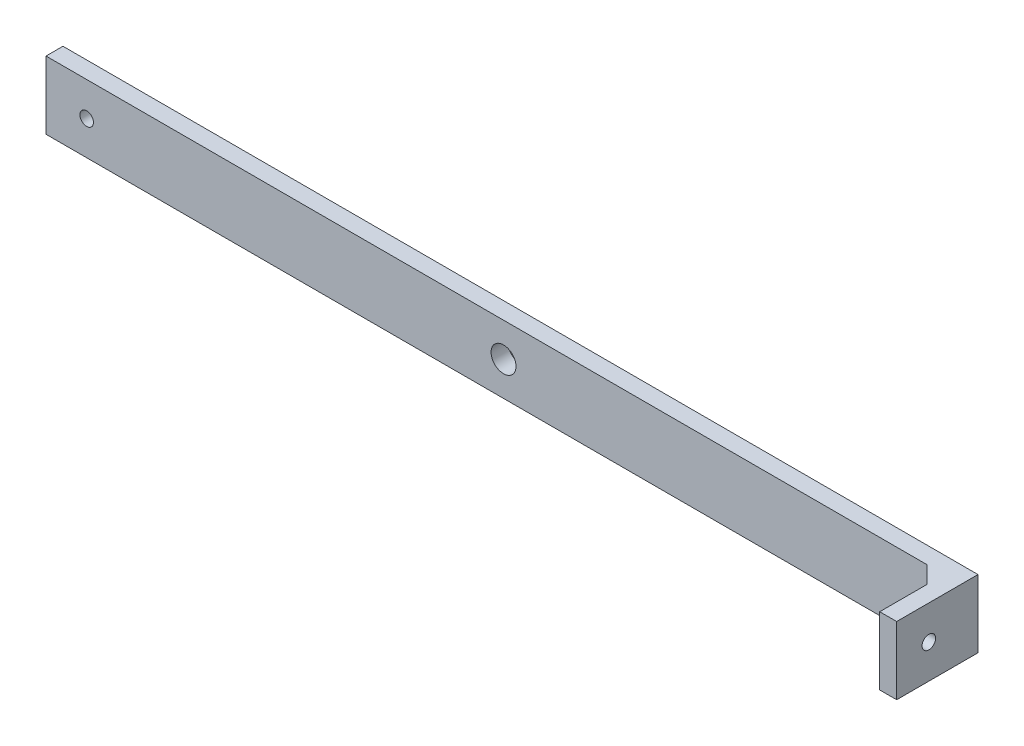
ISO-10303-21;
HEADER;
FILE_DESCRIPTION(('STEP AP214'),'2;1');
FILE_NAME('part.step','',(''),(''),'','','');
FILE_SCHEMA(('AUTOMOTIVE_DESIGN { 1 0 10303 214 1 1 1 1 }'));
ENDSEC;
DATA;
#1=APPLICATION_CONTEXT('core data for automotive mechanical design processes');
#2=APPLICATION_PROTOCOL_DEFINITION('international standard','automotive_design',2000,#1);
#3=PRODUCT_CONTEXT('',#1,'mechanical');
#4=PRODUCT('Part','Part','',(#3));
#5=PRODUCT_RELATED_PRODUCT_CATEGORY('part','',(#4));
#6=PRODUCT_DEFINITION_FORMATION('','',#4);
#7=PRODUCT_DEFINITION_CONTEXT('part definition',#1,'design');
#8=PRODUCT_DEFINITION('design','',#6,#7);
#9=PRODUCT_DEFINITION_SHAPE('','',#8);
#10=(LENGTH_UNIT() NAMED_UNIT(*) SI_UNIT(.MILLI.,.METRE.));
#11=(NAMED_UNIT(*) PLANE_ANGLE_UNIT() SI_UNIT($,.RADIAN.));
#12=(NAMED_UNIT(*) SI_UNIT($,.STERADIAN.) SOLID_ANGLE_UNIT());
#13=UNCERTAINTY_MEASURE_WITH_UNIT(LENGTH_MEASURE(1.E-05),#10,'distance_accuracy_value','');
#14=(GEOMETRIC_REPRESENTATION_CONTEXT(3) GLOBAL_UNCERTAINTY_ASSIGNED_CONTEXT((#13)) GLOBAL_UNIT_ASSIGNED_CONTEXT((#10,
#11,#12)) REPRESENTATION_CONTEXT('',''));
#15=CARTESIAN_POINT('',(0.,0.,0.));
#16=DIRECTION('',(0.,0.,1.));
#17=DIRECTION('',(1.,0.,0.));
#18=AXIS2_PLACEMENT_3D('',#15,#16,#17);
#19=CARTESIAN_POINT('',(0.,0.,5.));
#20=DIRECTION('',(0.,0.,-1.));
#21=DIRECTION('',(-1.,0.,0.));
#22=AXIS2_PLACEMENT_3D('',#19,#20,#21);
#23=PLANE('',#22);
#24=CARTESIAN_POINT('',(0.,0.,5.));
#25=DIRECTION('',(0.,0.,-1.));
#26=DIRECTION('',(-1.,0.,0.));
#27=AXIS2_PLACEMENT_3D('',#24,#25,#26);
#28=CIRCLE('',#27,3.68294157014292);
#29=CARTESIAN_POINT('',(-3.68294157014292,0.,5.));
#30=VERTEX_POINT('',#29);
#31=EDGE_CURVE('E376',#30,#30,#28,.T.);
#32=ORIENTED_EDGE('',*,*,#31,.T.);
#33=EDGE_LOOP('',(#32));
#34=FACE_BOUND('',#33,.T.);
#35=CARTESIAN_POINT('',(-123.,0.,5.));
#36=DIRECTION('',(0.,0.,-1.));
#37=DIRECTION('',(-1.,0.,0.));
#38=AXIS2_PLACEMENT_3D('',#35,#36,#37);
#39=CIRCLE('',#38,2.);
#40=CARTESIAN_POINT('',(-125.,0.,5.));
#41=VERTEX_POINT('',#40);
#42=EDGE_CURVE('E380',#41,#41,#39,.T.);
#43=ORIENTED_EDGE('',*,*,#42,.T.);
#44=EDGE_LOOP('',(#43));
#45=FACE_BOUND('',#44,.T.);
#46=DIRECTION('',(1.,0.,0.));
#47=VECTOR('',#46,1.);
#48=CARTESIAN_POINT('',(125.,5.,5.));
#49=LINE('',#48,#47);
#50=CARTESIAN_POINT('',(125.,5.,5.));
#51=VERTEX_POINT('',#50);
#52=CARTESIAN_POINT('',(130.,5.,5.));
#53=VERTEX_POINT('',#52);
#54=EDGE_CURVE('E200',#51,#53,#49,.T.);
#55=ORIENTED_EDGE('',*,*,#54,.F.);
#56=DIRECTION('',(0.,-1.,0.));
#57=VECTOR('',#56,1.);
#58=CARTESIAN_POINT('',(125.,10.,5.));
#59=LINE('',#58,#57);
#60=CARTESIAN_POINT('',(125.,10.,5.));
#61=VERTEX_POINT('',#60);
#62=EDGE_CURVE('E117',#61,#51,#59,.T.);
#63=ORIENTED_EDGE('',*,*,#62,.F.);
#64=DIRECTION('',(-1.,0.,0.));
#65=VECTOR('',#64,1.);
#66=CARTESIAN_POINT('',(-135.,10.,5.));
#67=LINE('',#66,#65);
#68=CARTESIAN_POINT('',(-135.,10.,5.));
#69=VERTEX_POINT('',#68);
#70=EDGE_CURVE('E127',#61,#69,#67,.T.);
#71=ORIENTED_EDGE('',*,*,#70,.T.);
#72=DIRECTION('',(0.,-1.,0.));
#73=VECTOR('',#72,1.);
#74=CARTESIAN_POINT('',(-135.,-10.,5.));
#75=LINE('',#74,#73);
#76=CARTESIAN_POINT('',(-135.,-10.,5.));
#77=VERTEX_POINT('',#76);
#78=EDGE_CURVE('E147',#69,#77,#75,.T.);
#79=ORIENTED_EDGE('',*,*,#78,.T.);
#80=DIRECTION('',(1.,0.,0.));
#81=VECTOR('',#80,1.);
#82=CARTESIAN_POINT('',(-135.,-10.,5.));
#83=LINE('',#82,#81);
#84=CARTESIAN_POINT('',(125.,-10.,5.));
#85=VERTEX_POINT('',#84);
#86=EDGE_CURVE('E150',#77,#85,#83,.T.);
#87=ORIENTED_EDGE('',*,*,#86,.T.);
#88=DIRECTION('',(0.,-1.,0.));
#89=VECTOR('',#88,1.);
#90=CARTESIAN_POINT('',(125.,-10.,5.));
#91=LINE('',#90,#89);
#92=CARTESIAN_POINT('',(125.,-5.,5.));
#93=VERTEX_POINT('',#92);
#94=EDGE_CURVE('E202',#93,#85,#91,.T.);
#95=ORIENTED_EDGE('',*,*,#94,.F.);
#96=DIRECTION('',(1.,0.,0.));
#97=VECTOR('',#96,1.);
#98=CARTESIAN_POINT('',(125.,-5.,5.));
#99=LINE('',#98,#97);
#100=CARTESIAN_POINT('',(130.,-5.,5.));
#101=VERTEX_POINT('',#100);
#102=EDGE_CURVE('E207',#93,#101,#99,.T.);
#103=ORIENTED_EDGE('',*,*,#102,.T.);
#104=DIRECTION('',(0.,-1.,0.));
#105=VECTOR('',#104,1.);
#106=CARTESIAN_POINT('',(130.,10.,5.));
#107=LINE('',#106,#105);
#108=EDGE_CURVE('E184',#53,#101,#107,.T.);
#109=ORIENTED_EDGE('',*,*,#108,.F.);
#110=EDGE_LOOP('',(#55,#63,#71,#79,#87,#95,#103,#109));
#111=FACE_BOUND('',#110,.T.);
#112=ADVANCED_FACE('F36',(#34,#45,#111),#23,.F.);
#113=CARTESIAN_POINT('',(130.,10.,24.));
#114=DIRECTION('',(1.,0.,0.));
#115=DIRECTION('',(0.,0.,-1.));
#116=AXIS2_PLACEMENT_3D('',#113,#114,#115);
#117=PLANE('',#116);
#118=DIRECTION('',(0.,0.,-1.));
#119=VECTOR('',#118,1.);
#120=CARTESIAN_POINT('',(130.,-5.,5.));
#121=LINE('',#120,#119);
#122=CARTESIAN_POINT('',(130.,-5.,10.));
#123=VERTEX_POINT('',#122);
#124=EDGE_CURVE('E197',#123,#101,#121,.T.);
#125=ORIENTED_EDGE('',*,*,#124,.F.);
#126=DIRECTION('',(0.,1.,0.));
#127=VECTOR('',#126,1.);
#128=CARTESIAN_POINT('',(130.,-10.,10.));
#129=LINE('',#128,#127);
#130=CARTESIAN_POINT('',(130.,-10.,10.));
#131=VERTEX_POINT('',#130);
#132=EDGE_CURVE('E195',#131,#123,#129,.T.);
#133=ORIENTED_EDGE('',*,*,#132,.F.);
#134=DIRECTION('',(0.,0.,-1.));
#135=VECTOR('',#134,1.);
#136=CARTESIAN_POINT('',(130.,-10.,24.));
#137=LINE('',#136,#135);
#138=CARTESIAN_POINT('',(130.,-10.,24.));
#139=VERTEX_POINT('',#138);
#140=EDGE_CURVE('E136',#139,#131,#137,.T.);
#141=ORIENTED_EDGE('',*,*,#140,.F.);
#142=DIRECTION('',(0.,-1.,0.));
#143=VECTOR('',#142,1.);
#144=CARTESIAN_POINT('',(130.,10.,24.));
#145=LINE('',#144,#143);
#146=CARTESIAN_POINT('',(130.,10.,24.));
#147=VERTEX_POINT('',#146);
#148=EDGE_CURVE('E134',#147,#139,#145,.T.);
#149=ORIENTED_EDGE('',*,*,#148,.F.);
#150=DIRECTION('',(0.,0.,-1.));
#151=VECTOR('',#150,1.);
#152=CARTESIAN_POINT('',(130.,10.,24.));
#153=LINE('',#152,#151);
#154=CARTESIAN_POINT('',(130.,10.,10.));
#155=VERTEX_POINT('',#154);
#156=EDGE_CURVE('E124',#147,#155,#153,.T.);
#157=ORIENTED_EDGE('',*,*,#156,.T.);
#158=DIRECTION('',(0.,1.,0.));
#159=VECTOR('',#158,1.);
#160=CARTESIAN_POINT('',(130.,10.,10.));
#161=LINE('',#160,#159);
#162=CARTESIAN_POINT('',(130.,5.,10.));
#163=VERTEX_POINT('',#162);
#164=EDGE_CURVE('E112',#163,#155,#161,.T.);
#165=ORIENTED_EDGE('',*,*,#164,.F.);
#166=DIRECTION('',(0.,0.,1.));
#167=VECTOR('',#166,1.);
#168=CARTESIAN_POINT('',(130.,5.,5.));
#169=LINE('',#168,#167);
#170=EDGE_CURVE('E52',#53,#163,#169,.T.);
#171=ORIENTED_EDGE('',*,*,#170,.F.);
#172=ORIENTED_EDGE('',*,*,#108,.T.);
#173=EDGE_LOOP('',(#125,#133,#141,#149,#157,#165,#171,#172));
#174=FACE_BOUND('',#173,.T.);
#175=CARTESIAN_POINT('',(130.,0.,14.5));
#176=DIRECTION('',(1.,0.,0.));
#177=DIRECTION('',(0.,0.,-1.));
#178=AXIS2_PLACEMENT_3D('',#175,#176,#177);
#179=CIRCLE('',#178,2.);
#180=CARTESIAN_POINT('',(130.,0.,12.5));
#181=VERTEX_POINT('',#180);
#182=EDGE_CURVE('E40',#181,#181,#179,.T.);
#183=ORIENTED_EDGE('',*,*,#182,.T.);
#184=EDGE_LOOP('',(#183));
#185=FACE_BOUND('',#184,.T.);
#186=ADVANCED_FACE('F131',(#174,#185),#117,.F.);
#187=CARTESIAN_POINT('',(135.,-10.,5.));
#188=DIRECTION('',(-1.,0.,0.));
#189=DIRECTION('',(0.,0.,1.));
#190=AXIS2_PLACEMENT_3D('',#187,#188,#189);
#191=PLANE('',#190);
#192=CARTESIAN_POINT('',(135.,0.,14.5));
#193=DIRECTION('',(1.,0.,0.));
#194=DIRECTION('',(0.,0.,-1.));
#195=AXIS2_PLACEMENT_3D('',#192,#193,#194);
#196=CIRCLE('',#195,2.);
#197=CARTESIAN_POINT('',(135.,0.,12.5));
#198=VERTEX_POINT('',#197);
#199=EDGE_CURVE('E188',#198,#198,#196,.T.);
#200=ORIENTED_EDGE('',*,*,#199,.F.);
#201=EDGE_LOOP('',(#200));
#202=FACE_BOUND('',#201,.T.);
#203=DIRECTION('',(0.,1.,0.));
#204=VECTOR('',#203,1.);
#205=CARTESIAN_POINT('',(135.,-10.,0.));
#206=LINE('',#205,#204);
#207=CARTESIAN_POINT('',(135.,-10.,0.));
#208=VERTEX_POINT('',#207);
#209=CARTESIAN_POINT('',(135.,10.,0.));
#210=VERTEX_POINT('',#209);
#211=EDGE_CURVE('E135',#208,#210,#206,.T.);
#212=ORIENTED_EDGE('',*,*,#211,.T.);
#213=DIRECTION('',(0.,0.,-1.));
#214=VECTOR('',#213,1.);
#215=CARTESIAN_POINT('',(135.,10.,5.));
#216=LINE('',#215,#214);
#217=CARTESIAN_POINT('',(135.,10.,24.));
#218=VERTEX_POINT('',#217);
#219=EDGE_CURVE('E11',#218,#210,#216,.T.);
#220=ORIENTED_EDGE('',*,*,#219,.F.);
#221=DIRECTION('',(0.,1.,0.));
#222=VECTOR('',#221,1.);
#223=CARTESIAN_POINT('',(135.,10.,24.));
#224=LINE('',#223,#222);
#225=CARTESIAN_POINT('',(135.,-10.,24.));
#226=VERTEX_POINT('',#225);
#227=EDGE_CURVE('E181',#226,#218,#224,.T.);
#228=ORIENTED_EDGE('',*,*,#227,.F.);
#229=DIRECTION('',(0.,0.,-1.));
#230=VECTOR('',#229,1.);
#231=CARTESIAN_POINT('',(135.,-10.,5.));
#232=LINE('',#231,#230);
#233=EDGE_CURVE('E152',#226,#208,#232,.T.);
#234=ORIENTED_EDGE('',*,*,#233,.T.);
#235=EDGE_LOOP('',(#212,#220,#228,#234));
#236=FACE_BOUND('',#235,.T.);
#237=ADVANCED_FACE('F38',(#202,#236),#191,.F.);
#238=CARTESIAN_POINT('',(-135.,10.,5.));
#239=DIRECTION('',(0.,-1.,0.));
#240=DIRECTION('',(0.,0.,-1.));
#241=AXIS2_PLACEMENT_3D('',#238,#239,#240);
#242=PLANE('',#241);
#243=ORIENTED_EDGE('',*,*,#70,.F.);
#244=DIRECTION('',(0.707106781186548,0.,0.707106781186547));
#245=VECTOR('',#244,1.);
#246=CARTESIAN_POINT('',(125.,10.,5.));
#247=LINE('',#246,#245);
#248=EDGE_CURVE('E60',#61,#155,#247,.T.);
#249=ORIENTED_EDGE('',*,*,#248,.T.);
#250=ORIENTED_EDGE('',*,*,#156,.F.);
#251=DIRECTION('',(-1.,0.,0.));
#252=VECTOR('',#251,1.);
#253=CARTESIAN_POINT('',(135.,10.,24.));
#254=LINE('',#253,#252);
#255=EDGE_CURVE('E183',#218,#147,#254,.T.);
#256=ORIENTED_EDGE('',*,*,#255,.F.);
#257=ORIENTED_EDGE('',*,*,#219,.T.);
#258=DIRECTION('',(-1.,0.,0.));
#259=VECTOR('',#258,1.);
#260=CARTESIAN_POINT('',(-135.,10.,0.));
#261=LINE('',#260,#259);
#262=CARTESIAN_POINT('',(-135.,10.,0.));
#263=VERTEX_POINT('',#262);
#264=EDGE_CURVE('E139',#210,#263,#261,.T.);
#265=ORIENTED_EDGE('',*,*,#264,.T.);
#266=DIRECTION('',(0.,0.,-1.));
#267=VECTOR('',#266,1.);
#268=CARTESIAN_POINT('',(-135.,10.,5.));
#269=LINE('',#268,#267);
#270=EDGE_CURVE('E45',#69,#263,#269,.T.);
#271=ORIENTED_EDGE('',*,*,#270,.F.);
#272=EDGE_LOOP('',(#243,#249,#250,#256,#257,#265,#271));
#273=FACE_BOUND('',#272,.T.);
#274=ADVANCED_FACE('F122',(#273),#242,.F.);
#275=CARTESIAN_POINT('',(-135.,-10.,5.));
#276=DIRECTION('',(1.,0.,0.));
#277=DIRECTION('',(0.,0.,-1.));
#278=AXIS2_PLACEMENT_3D('',#275,#276,#277);
#279=PLANE('',#278);
#280=DIRECTION('',(0.,-1.,0.));
#281=VECTOR('',#280,1.);
#282=CARTESIAN_POINT('',(-135.,-10.,0.));
#283=LINE('',#282,#281);
#284=CARTESIAN_POINT('',(-135.,-10.,0.));
#285=VERTEX_POINT('',#284);
#286=EDGE_CURVE('E155',#263,#285,#283,.T.);
#287=ORIENTED_EDGE('',*,*,#286,.T.);
#288=DIRECTION('',(0.,0.,-1.));
#289=VECTOR('',#288,1.);
#290=CARTESIAN_POINT('',(-135.,-10.,5.));
#291=LINE('',#290,#289);
#292=EDGE_CURVE('E160',#77,#285,#291,.T.);
#293=ORIENTED_EDGE('',*,*,#292,.F.);
#294=ORIENTED_EDGE('',*,*,#78,.F.);
#295=ORIENTED_EDGE('',*,*,#270,.T.);
#296=EDGE_LOOP('',(#287,#293,#294,#295));
#297=FACE_BOUND('',#296,.T.);
#298=ADVANCED_FACE('F167',(#297),#279,.F.);
#299=CARTESIAN_POINT('',(-135.,-10.,5.));
#300=DIRECTION('',(0.,1.,0.));
#301=DIRECTION('',(0.,0.,1.));
#302=AXIS2_PLACEMENT_3D('',#299,#300,#301);
#303=PLANE('',#302);
#304=ORIENTED_EDGE('',*,*,#140,.T.);
#305=DIRECTION('',(0.707106781186548,0.,0.707106781186547));
#306=VECTOR('',#305,1.);
#307=CARTESIAN_POINT('',(125.,-10.,5.));
#308=LINE('',#307,#306);
#309=EDGE_CURVE('E128',#85,#131,#308,.T.);
#310=ORIENTED_EDGE('',*,*,#309,.F.);
#311=ORIENTED_EDGE('',*,*,#86,.F.);
#312=ORIENTED_EDGE('',*,*,#292,.T.);
#313=DIRECTION('',(1.,0.,0.));
#314=VECTOR('',#313,1.);
#315=CARTESIAN_POINT('',(-135.,-10.,0.));
#316=LINE('',#315,#314);
#317=EDGE_CURVE('E148',#285,#208,#316,.T.);
#318=ORIENTED_EDGE('',*,*,#317,.T.);
#319=ORIENTED_EDGE('',*,*,#233,.F.);
#320=DIRECTION('',(1.,0.,0.));
#321=VECTOR('',#320,1.);
#322=CARTESIAN_POINT('',(135.,-10.,24.));
#323=LINE('',#322,#321);
#324=EDGE_CURVE('E142',#139,#226,#323,.T.);
#325=ORIENTED_EDGE('',*,*,#324,.F.);
#326=EDGE_LOOP('',(#304,#310,#311,#312,#318,#319,#325));
#327=FACE_BOUND('',#326,.T.);
#328=ADVANCED_FACE('F174',(#327),#303,.F.);
#329=CARTESIAN_POINT('',(0.,0.,0.));
#330=DIRECTION('',(0.,0.,-1.));
#331=DIRECTION('',(-1.,0.,0.));
#332=AXIS2_PLACEMENT_3D('',#329,#330,#331);
#333=PLANE('',#332);
#334=CARTESIAN_POINT('',(0.,0.,0.));
#335=DIRECTION('',(0.,0.,-1.));
#336=DIRECTION('',(-1.,0.,0.));
#337=AXIS2_PLACEMENT_3D('',#334,#335,#336);
#338=CIRCLE('',#337,3.68294157014292);
#339=CARTESIAN_POINT('',(-3.68294157014292,0.,0.));
#340=VERTEX_POINT('',#339);
#341=EDGE_CURVE('E374',#340,#340,#338,.T.);
#342=ORIENTED_EDGE('',*,*,#341,.F.);
#343=EDGE_LOOP('',(#342));
#344=FACE_BOUND('',#343,.T.);
#345=CARTESIAN_POINT('',(-123.,0.,0.));
#346=DIRECTION('',(0.,0.,-1.));
#347=DIRECTION('',(-1.,0.,0.));
#348=AXIS2_PLACEMENT_3D('',#345,#346,#347);
#349=CIRCLE('',#348,2.);
#350=CARTESIAN_POINT('',(-125.,0.,0.));
#351=VERTEX_POINT('',#350);
#352=EDGE_CURVE('E377',#351,#351,#349,.T.);
#353=ORIENTED_EDGE('',*,*,#352,.F.);
#354=EDGE_LOOP('',(#353));
#355=FACE_BOUND('',#354,.T.);
#356=ORIENTED_EDGE('',*,*,#211,.F.);
#357=ORIENTED_EDGE('',*,*,#317,.F.);
#358=ORIENTED_EDGE('',*,*,#286,.F.);
#359=ORIENTED_EDGE('',*,*,#264,.F.);
#360=EDGE_LOOP('',(#356,#357,#358,#359));
#361=FACE_BOUND('',#360,.T.);
#362=ADVANCED_FACE('F172',(#344,#355,#361),#333,.T.);
#363=CARTESIAN_POINT('',(0.,0.,24.));
#364=DIRECTION('',(0.,0.,-1.));
#365=DIRECTION('',(-1.,0.,0.));
#366=AXIS2_PLACEMENT_3D('',#363,#364,#365);
#367=PLANE('',#366);
#368=ORIENTED_EDGE('',*,*,#227,.T.);
#369=ORIENTED_EDGE('',*,*,#255,.T.);
#370=ORIENTED_EDGE('',*,*,#148,.T.);
#371=ORIENTED_EDGE('',*,*,#324,.T.);
#372=EDGE_LOOP('',(#368,#369,#370,#371));
#373=FACE_BOUND('',#372,.T.);
#374=ADVANCED_FACE('F192',(#373),#367,.F.);
#375=CARTESIAN_POINT('',(-135.,0.,14.5));
#376=DIRECTION('',(1.,0.,0.));
#377=DIRECTION('',(0.,0.,-1.));
#378=AXIS2_PLACEMENT_3D('',#375,#376,#377);
#379=CYLINDRICAL_SURFACE('',#378,2.);
#380=ORIENTED_EDGE('',*,*,#199,.T.);
#381=EDGE_LOOP('',(#380));
#382=FACE_BOUND('',#381,.T.);
#383=ORIENTED_EDGE('',*,*,#182,.F.);
#384=EDGE_LOOP('',(#383));
#385=FACE_BOUND('',#384,.T.);
#386=ADVANCED_FACE('F232',(#382,#385),#379,.F.);
#387=CARTESIAN_POINT('',(125.,-5.,5.));
#388=DIRECTION('',(0.,-1.,0.));
#389=DIRECTION('',(0.,0.,-1.));
#390=AXIS2_PLACEMENT_3D('',#387,#388,#389);
#391=PLANE('',#390);
#392=ORIENTED_EDGE('',*,*,#102,.F.);
#393=DIRECTION('',(0.707106781186548,0.,0.707106781186547));
#394=VECTOR('',#393,1.);
#395=CARTESIAN_POINT('',(125.,-5.,5.));
#396=LINE('',#395,#394);
#397=EDGE_CURVE('E214',#93,#123,#396,.T.);
#398=ORIENTED_EDGE('',*,*,#397,.T.);
#399=ORIENTED_EDGE('',*,*,#124,.T.);
#400=EDGE_LOOP('',(#392,#398,#399));
#401=FACE_BOUND('',#400,.T.);
#402=ADVANCED_FACE('F217',(#401),#391,.F.);
#403=CARTESIAN_POINT('',(125.,5.,5.));
#404=DIRECTION('',(0.,1.,0.));
#405=DIRECTION('',(0.,0.,1.));
#406=AXIS2_PLACEMENT_3D('',#403,#404,#405);
#407=PLANE('',#406);
#408=ORIENTED_EDGE('',*,*,#170,.T.);
#409=DIRECTION('',(-0.707106781186548,0.,-0.707106781186547));
#410=VECTOR('',#409,1.);
#411=CARTESIAN_POINT('',(125.,5.,5.));
#412=LINE('',#411,#410);
#413=EDGE_CURVE('E115',#163,#51,#412,.T.);
#414=ORIENTED_EDGE('',*,*,#413,.T.);
#415=ORIENTED_EDGE('',*,*,#54,.T.);
#416=EDGE_LOOP('',(#408,#414,#415));
#417=FACE_BOUND('',#416,.T.);
#418=ADVANCED_FACE('F224',(#417),#407,.F.);
#419=CARTESIAN_POINT('',(125.,10.,5.));
#420=DIRECTION('',(0.707106781186547,0.,-0.707106781186548));
#421=DIRECTION('',(-0.707106781186548,0.,-0.707106781186547));
#422=AXIS2_PLACEMENT_3D('',#419,#420,#421);
#423=PLANE('',#422);
#424=ORIENTED_EDGE('',*,*,#164,.T.);
#425=ORIENTED_EDGE('',*,*,#248,.F.);
#426=ORIENTED_EDGE('',*,*,#62,.T.);
#427=ORIENTED_EDGE('',*,*,#413,.F.);
#428=EDGE_LOOP('',(#424,#425,#426,#427));
#429=FACE_BOUND('',#428,.T.);
#430=ADVANCED_FACE('F113',(#429),#423,.F.);
#431=ORIENTED_EDGE('',*,*,#94,.T.);
#432=ORIENTED_EDGE('',*,*,#309,.T.);
#433=ORIENTED_EDGE('',*,*,#132,.T.);
#434=ORIENTED_EDGE('',*,*,#397,.F.);
#435=EDGE_LOOP('',(#431,#432,#433,#434));
#436=FACE_BOUND('',#435,.T.);
#437=ADVANCED_FACE('F213',(#436),#423,.F.);
#438=CARTESIAN_POINT('',(-123.,0.,24.));
#439=DIRECTION('',(0.,0.,-1.));
#440=DIRECTION('',(-1.,0.,0.));
#441=AXIS2_PLACEMENT_3D('',#438,#439,#440);
#442=CYLINDRICAL_SURFACE('',#441,2.);
#443=ORIENTED_EDGE('',*,*,#352,.T.);
#444=EDGE_LOOP('',(#443));
#445=FACE_BOUND('',#444,.T.);
#446=ORIENTED_EDGE('',*,*,#42,.F.);
#447=EDGE_LOOP('',(#446));
#448=FACE_BOUND('',#447,.T.);
#449=ADVANCED_FACE('F351',(#445,#448),#442,.F.);
#450=CARTESIAN_POINT('',(0.,0.,10.));
#451=DIRECTION('',(0.,0.,-1.));
#452=DIRECTION('',(-1.,0.,0.));
#453=AXIS2_PLACEMENT_3D('',#450,#451,#452);
#454=CYLINDRICAL_SURFACE('',#453,3.68294157014292);
#455=ORIENTED_EDGE('',*,*,#341,.T.);
#456=EDGE_LOOP('',(#455));
#457=FACE_BOUND('',#456,.T.);
#458=ORIENTED_EDGE('',*,*,#31,.F.);
#459=EDGE_LOOP('',(#458));
#460=FACE_BOUND('',#459,.T.);
#461=ADVANCED_FACE('F357',(#457,#460),#454,.F.);
#462=CLOSED_SHELL('',(#112,#186,#237,#274,#298,#328,#362,#374,#386,#402,#418,#430,#437,#449,#461));
#463=MANIFOLD_SOLID_BREP('B2',#462);
#464=ADVANCED_BREP_SHAPE_REPRESENTATION('',(#18,#463),#14);
#465=SHAPE_DEFINITION_REPRESENTATION(#9,#464);
ENDSEC;
END-ISO-10303-21;
